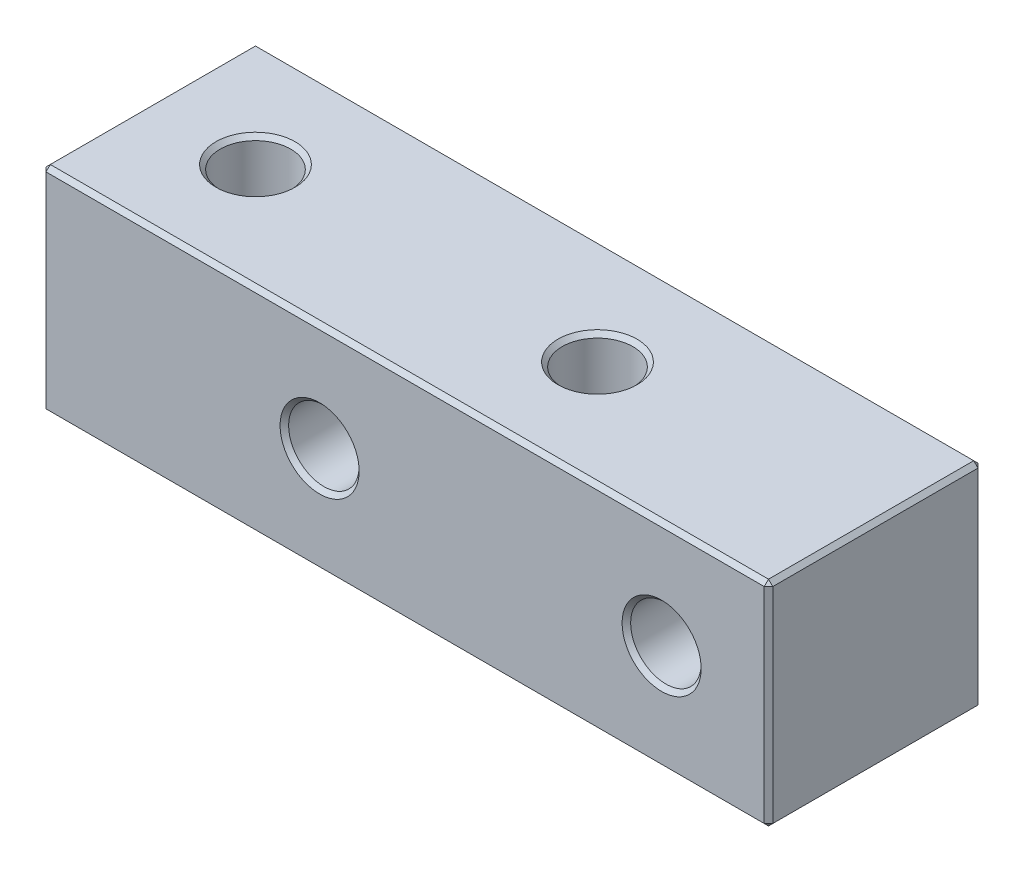
ISO-10303-21;
HEADER;
FILE_DESCRIPTION(('STEP AP214'),'2;1');
FILE_NAME('part.step','',(''),(''),'','','');
FILE_SCHEMA(('AUTOMOTIVE_DESIGN { 1 0 10303 214 1 1 1 1 }'));
ENDSEC;
DATA;
#1=APPLICATION_CONTEXT('core data for automotive mechanical design processes');
#2=APPLICATION_PROTOCOL_DEFINITION('international standard','automotive_design',2000,#1);
#3=PRODUCT_CONTEXT('',#1,'mechanical');
#4=PRODUCT('Part','Part','',(#3));
#5=PRODUCT_RELATED_PRODUCT_CATEGORY('part','',(#4));
#6=PRODUCT_DEFINITION_FORMATION('','',#4);
#7=PRODUCT_DEFINITION_CONTEXT('part definition',#1,'design');
#8=PRODUCT_DEFINITION('design','',#6,#7);
#9=PRODUCT_DEFINITION_SHAPE('','',#8);
#10=(LENGTH_UNIT() NAMED_UNIT(*) SI_UNIT(.MILLI.,.METRE.));
#11=(NAMED_UNIT(*) PLANE_ANGLE_UNIT() SI_UNIT($,.RADIAN.));
#12=(NAMED_UNIT(*) SI_UNIT($,.STERADIAN.) SOLID_ANGLE_UNIT());
#13=UNCERTAINTY_MEASURE_WITH_UNIT(LENGTH_MEASURE(1.E-05),#10,'distance_accuracy_value','');
#14=(GEOMETRIC_REPRESENTATION_CONTEXT(3) GLOBAL_UNCERTAINTY_ASSIGNED_CONTEXT((#13)) GLOBAL_UNIT_ASSIGNED_CONTEXT((#10,
#11,#12)) REPRESENTATION_CONTEXT('',''));
#15=CARTESIAN_POINT('',(0.,0.,0.));
#16=DIRECTION('',(0.,0.,1.));
#17=DIRECTION('',(1.,0.,0.));
#18=AXIS2_PLACEMENT_3D('',#15,#16,#17);
#19=CARTESIAN_POINT('',(17.,5.,-5.));
#20=DIRECTION('',(-1.,0.,0.));
#21=DIRECTION('',(0.,0.,1.));
#22=AXIS2_PLACEMENT_3D('',#19,#20,#21);
#23=PLANE('',#22);
#24=DIRECTION('',(0.,-1.,0.));
#25=VECTOR('',#24,1.);
#26=CARTESIAN_POINT('',(17.,5.,4.79999999999999));
#27=LINE('',#26,#25);
#28=CARTESIAN_POINT('',(17.,4.79999999999999,4.79999999999999));
#29=VERTEX_POINT('',#28);
#30=CARTESIAN_POINT('',(17.,-4.79999999999999,4.79999999999999));
#31=VERTEX_POINT('',#30);
#32=EDGE_CURVE('E239',#29,#31,#27,.T.);
#33=ORIENTED_EDGE('',*,*,#32,.T.);
#34=DIRECTION('',(0.,0.,-1.));
#35=VECTOR('',#34,1.);
#36=CARTESIAN_POINT('',(17.,-4.79999999999999,-5.));
#37=LINE('',#36,#35);
#38=CARTESIAN_POINT('',(17.,-4.79999999999999,-4.79999999999999));
#39=VERTEX_POINT('',#38);
#40=EDGE_CURVE('E241',#31,#39,#37,.T.);
#41=ORIENTED_EDGE('',*,*,#40,.T.);
#42=DIRECTION('',(0.,1.,0.));
#43=VECTOR('',#42,1.);
#44=CARTESIAN_POINT('',(17.,5.,-4.79999999999999));
#45=LINE('',#44,#43);
#46=CARTESIAN_POINT('',(17.,4.79999999999999,-4.79999999999999));
#47=VERTEX_POINT('',#46);
#48=EDGE_CURVE('E235',#39,#47,#45,.T.);
#49=ORIENTED_EDGE('',*,*,#48,.T.);
#50=DIRECTION('',(0.,0.,1.));
#51=VECTOR('',#50,1.);
#52=CARTESIAN_POINT('',(17.,4.79999999999999,5.));
#53=LINE('',#52,#51);
#54=EDGE_CURVE('E237',#47,#29,#53,.T.);
#55=ORIENTED_EDGE('',*,*,#54,.T.);
#56=EDGE_LOOP('',(#33,#41,#49,#55));
#57=FACE_BOUND('',#56,.T.);
#58=ADVANCED_FACE('F39',(#57),#23,.F.);
#59=CARTESIAN_POINT('',(-17.,5.,-5.));
#60=DIRECTION('',(0.,0.,1.));
#61=DIRECTION('',(1.,0.,0.));
#62=AXIS2_PLACEMENT_3D('',#59,#60,#61);
#63=PLANE('',#62);
#64=DIRECTION('',(1.,0.,0.));
#65=VECTOR('',#64,1.);
#66=CARTESIAN_POINT('',(17.,4.79999999999999,-5.));
#67=LINE('',#66,#65);
#68=CARTESIAN_POINT('',(-16.8,4.79999999999999,-5.));
#69=VERTEX_POINT('',#68);
#70=CARTESIAN_POINT('',(16.8,4.79999999999999,-5.));
#71=VERTEX_POINT('',#70);
#72=EDGE_CURVE('E49',#69,#71,#67,.T.);
#73=ORIENTED_EDGE('',*,*,#72,.T.);
#74=DIRECTION('',(0.,-1.,0.));
#75=VECTOR('',#74,1.);
#76=CARTESIAN_POINT('',(16.8,5.,-5.));
#77=LINE('',#76,#75);
#78=CARTESIAN_POINT('',(16.8,-4.79999999999999,-5.));
#79=VERTEX_POINT('',#78);
#80=EDGE_CURVE('E11',#71,#79,#77,.T.);
#81=ORIENTED_EDGE('',*,*,#80,.T.);
#82=DIRECTION('',(-1.,0.,0.));
#83=VECTOR('',#82,1.);
#84=CARTESIAN_POINT('',(-17.,-4.79999999999999,-5.));
#85=LINE('',#84,#83);
#86=CARTESIAN_POINT('',(-16.8,-4.79999999999999,-5.));
#87=VERTEX_POINT('',#86);
#88=EDGE_CURVE('E250',#79,#87,#85,.T.);
#89=ORIENTED_EDGE('',*,*,#88,.T.);
#90=DIRECTION('',(0.,1.,0.));
#91=VECTOR('',#90,1.);
#92=CARTESIAN_POINT('',(-16.8,5.,-5.));
#93=LINE('',#92,#91);
#94=EDGE_CURVE('E60',#87,#69,#93,.T.);
#95=ORIENTED_EDGE('',*,*,#94,.T.);
#96=EDGE_LOOP('',(#73,#81,#89,#95));
#97=FACE_BOUND('',#96,.T.);
#98=CARTESIAN_POINT('',(-4.,0.,-5.));
#99=DIRECTION('',(0.,0.,1.));
#100=DIRECTION('',(1.,0.,0.));
#101=AXIS2_PLACEMENT_3D('',#98,#99,#100);
#102=CIRCLE('',#101,1.85);
#103=CARTESIAN_POINT('',(-2.15,0.,-5.));
#104=VERTEX_POINT('',#103);
#105=EDGE_CURVE('E247',#104,#104,#102,.T.);
#106=ORIENTED_EDGE('',*,*,#105,.T.);
#107=EDGE_LOOP('',(#106));
#108=FACE_BOUND('',#107,.T.);
#109=CARTESIAN_POINT('',(12.,0.,-5.));
#110=DIRECTION('',(0.,0.,1.));
#111=DIRECTION('',(1.,0.,0.));
#112=AXIS2_PLACEMENT_3D('',#109,#110,#111);
#113=CIRCLE('',#112,1.85);
#114=CARTESIAN_POINT('',(13.85,0.,-5.));
#115=VERTEX_POINT('',#114);
#116=EDGE_CURVE('E244',#115,#115,#113,.T.);
#117=ORIENTED_EDGE('',*,*,#116,.T.);
#118=EDGE_LOOP('',(#117));
#119=FACE_BOUND('',#118,.T.);
#120=ADVANCED_FACE('F322',(#97,#108,#119),#63,.F.);
#121=CARTESIAN_POINT('',(-17.,5.,-5.));
#122=DIRECTION('',(1.,0.,0.));
#123=DIRECTION('',(0.,0.,-1.));
#124=AXIS2_PLACEMENT_3D('',#121,#122,#123);
#125=PLANE('',#124);
#126=DIRECTION('',(0.,-1.,0.));
#127=VECTOR('',#126,1.);
#128=CARTESIAN_POINT('',(-17.,5.,-4.79999999999999));
#129=LINE('',#128,#127);
#130=CARTESIAN_POINT('',(-17.,4.79999999999999,-4.79999999999999));
#131=VERTEX_POINT('',#130);
#132=CARTESIAN_POINT('',(-17.,-4.79999999999999,-4.79999999999999));
#133=VERTEX_POINT('',#132);
#134=EDGE_CURVE('E228',#131,#133,#129,.T.);
#135=ORIENTED_EDGE('',*,*,#134,.T.);
#136=DIRECTION('',(0.,0.,1.));
#137=VECTOR('',#136,1.);
#138=CARTESIAN_POINT('',(-17.,-4.79999999999999,-5.));
#139=LINE('',#138,#137);
#140=CARTESIAN_POINT('',(-17.,-4.79999999999999,4.79999999999999));
#141=VERTEX_POINT('',#140);
#142=EDGE_CURVE('E136',#133,#141,#139,.T.);
#143=ORIENTED_EDGE('',*,*,#142,.T.);
#144=DIRECTION('',(0.,1.,0.));
#145=VECTOR('',#144,1.);
#146=CARTESIAN_POINT('',(-17.,5.,4.79999999999999));
#147=LINE('',#146,#145);
#148=CARTESIAN_POINT('',(-17.,4.79999999999999,4.79999999999999));
#149=VERTEX_POINT('',#148);
#150=EDGE_CURVE('E232',#141,#149,#147,.T.);
#151=ORIENTED_EDGE('',*,*,#150,.T.);
#152=DIRECTION('',(0.,0.,-1.));
#153=VECTOR('',#152,1.);
#154=CARTESIAN_POINT('',(-17.,4.79999999999999,-5.));
#155=LINE('',#154,#153);
#156=EDGE_CURVE('E230',#149,#131,#155,.T.);
#157=ORIENTED_EDGE('',*,*,#156,.T.);
#158=EDGE_LOOP('',(#135,#143,#151,#157));
#159=FACE_BOUND('',#158,.T.);
#160=ADVANCED_FACE('F379',(#159),#125,.F.);
#161=CARTESIAN_POINT('',(-17.,5.,5.));
#162=DIRECTION('',(0.,0.,-1.));
#163=DIRECTION('',(-1.,0.,0.));
#164=AXIS2_PLACEMENT_3D('',#161,#162,#163);
#165=PLANE('',#164);
#166=CARTESIAN_POINT('',(-4.,0.,5.));
#167=DIRECTION('',(0.,0.,-1.));
#168=DIRECTION('',(-1.,0.,0.));
#169=AXIS2_PLACEMENT_3D('',#166,#167,#168);
#170=CIRCLE('',#169,1.85);
#171=CARTESIAN_POINT('',(-5.85,0.,5.));
#172=VERTEX_POINT('',#171);
#173=EDGE_CURVE('E198',#172,#172,#170,.T.);
#174=ORIENTED_EDGE('',*,*,#173,.T.);
#175=EDGE_LOOP('',(#174));
#176=FACE_BOUND('',#175,.T.);
#177=CARTESIAN_POINT('',(12.,0.,5.));
#178=DIRECTION('',(0.,0.,-1.));
#179=DIRECTION('',(-1.,0.,0.));
#180=AXIS2_PLACEMENT_3D('',#177,#178,#179);
#181=CIRCLE('',#180,1.85);
#182=CARTESIAN_POINT('',(10.15,0.,5.));
#183=VERTEX_POINT('',#182);
#184=EDGE_CURVE('E195',#183,#183,#181,.T.);
#185=ORIENTED_EDGE('',*,*,#184,.T.);
#186=EDGE_LOOP('',(#185));
#187=FACE_BOUND('',#186,.T.);
#188=DIRECTION('',(-1.,0.,0.));
#189=VECTOR('',#188,1.);
#190=CARTESIAN_POINT('',(-17.,4.79999999999999,5.));
#191=LINE('',#190,#189);
#192=CARTESIAN_POINT('',(16.8,4.79999999999999,5.));
#193=VERTEX_POINT('',#192);
#194=CARTESIAN_POINT('',(-16.8,4.79999999999999,5.));
#195=VERTEX_POINT('',#194);
#196=EDGE_CURVE('E186',#193,#195,#191,.T.);
#197=ORIENTED_EDGE('',*,*,#196,.T.);
#198=DIRECTION('',(0.,-1.,0.));
#199=VECTOR('',#198,1.);
#200=CARTESIAN_POINT('',(-16.8,5.,5.));
#201=LINE('',#200,#199);
#202=CARTESIAN_POINT('',(-16.8,-4.79999999999999,5.));
#203=VERTEX_POINT('',#202);
#204=EDGE_CURVE('E192',#195,#203,#201,.T.);
#205=ORIENTED_EDGE('',*,*,#204,.T.);
#206=DIRECTION('',(1.,0.,0.));
#207=VECTOR('',#206,1.);
#208=CARTESIAN_POINT('',(-17.,-4.79999999999999,5.));
#209=LINE('',#208,#207);
#210=CARTESIAN_POINT('',(16.8,-4.79999999999999,5.));
#211=VERTEX_POINT('',#210);
#212=EDGE_CURVE('E190',#203,#211,#209,.T.);
#213=ORIENTED_EDGE('',*,*,#212,.T.);
#214=DIRECTION('',(0.,1.,0.));
#215=VECTOR('',#214,1.);
#216=CARTESIAN_POINT('',(16.8,5.,5.));
#217=LINE('',#216,#215);
#218=EDGE_CURVE('E188',#211,#193,#217,.T.);
#219=ORIENTED_EDGE('',*,*,#218,.T.);
#220=EDGE_LOOP('',(#197,#205,#213,#219));
#221=FACE_BOUND('',#220,.T.);
#222=ADVANCED_FACE('F554',(#176,#187,#221),#165,.F.);
#223=CARTESIAN_POINT('',(0.,5.,0.));
#224=DIRECTION('',(0.,1.,0.));
#225=DIRECTION('',(0.,0.,1.));
#226=AXIS2_PLACEMENT_3D('',#223,#224,#225);
#227=PLANE('',#226);
#228=CARTESIAN_POINT('',(4.,5.,0.));
#229=DIRECTION('',(0.,1.,0.));
#230=DIRECTION('',(0.,0.,1.));
#231=AXIS2_PLACEMENT_3D('',#228,#229,#230);
#232=CIRCLE('',#231,1.84999999999999);
#233=CARTESIAN_POINT('',(4.,5.,1.84999999999999));
#234=VERTEX_POINT('',#233);
#235=EDGE_CURVE('E225',#234,#234,#232,.F.);
#236=ORIENTED_EDGE('',*,*,#235,.T.);
#237=EDGE_LOOP('',(#236));
#238=FACE_BOUND('',#237,.T.);
#239=CARTESIAN_POINT('',(-12.,5.,0.));
#240=DIRECTION('',(0.,1.,0.));
#241=DIRECTION('',(0.,0.,1.));
#242=AXIS2_PLACEMENT_3D('',#239,#240,#241);
#243=CIRCLE('',#242,1.84999999999999);
#244=CARTESIAN_POINT('',(-12.,5.,1.85));
#245=VERTEX_POINT('',#244);
#246=EDGE_CURVE('E222',#245,#245,#243,.F.);
#247=ORIENTED_EDGE('',*,*,#246,.T.);
#248=EDGE_LOOP('',(#247));
#249=FACE_BOUND('',#248,.T.);
#250=DIRECTION('',(0.,0.,1.));
#251=VECTOR('',#250,1.);
#252=CARTESIAN_POINT('',(-16.8,5.,5.));
#253=LINE('',#252,#251);
#254=CARTESIAN_POINT('',(-16.8,5.,-4.79999999999999));
#255=VERTEX_POINT('',#254);
#256=CARTESIAN_POINT('',(-16.8,5.,4.79999999999999));
#257=VERTEX_POINT('',#256);
#258=EDGE_CURVE('E217',#255,#257,#253,.T.);
#259=ORIENTED_EDGE('',*,*,#258,.T.);
#260=DIRECTION('',(1.,0.,0.));
#261=VECTOR('',#260,1.);
#262=CARTESIAN_POINT('',(17.,5.,4.79999999999999));
#263=LINE('',#262,#261);
#264=CARTESIAN_POINT('',(16.8,5.,4.79999999999999));
#265=VERTEX_POINT('',#264);
#266=EDGE_CURVE('E219',#257,#265,#263,.T.);
#267=ORIENTED_EDGE('',*,*,#266,.T.);
#268=DIRECTION('',(0.,0.,-1.));
#269=VECTOR('',#268,1.);
#270=CARTESIAN_POINT('',(16.8,5.,-5.));
#271=LINE('',#270,#269);
#272=CARTESIAN_POINT('',(16.8,5.,-4.79999999999999));
#273=VERTEX_POINT('',#272);
#274=EDGE_CURVE('E215',#265,#273,#271,.T.);
#275=ORIENTED_EDGE('',*,*,#274,.T.);
#276=DIRECTION('',(-1.,0.,0.));
#277=VECTOR('',#276,1.);
#278=CARTESIAN_POINT('',(-17.,5.,-4.79999999999999));
#279=LINE('',#278,#277);
#280=EDGE_CURVE('E213',#273,#255,#279,.T.);
#281=ORIENTED_EDGE('',*,*,#280,.T.);
#282=EDGE_LOOP('',(#259,#267,#275,#281));
#283=FACE_BOUND('',#282,.T.);
#284=ADVANCED_FACE('F336',(#238,#249,#283),#227,.T.);
#285=CARTESIAN_POINT('',(0.,-5.,0.));
#286=DIRECTION('',(0.,1.,0.));
#287=DIRECTION('',(0.,0.,1.));
#288=AXIS2_PLACEMENT_3D('',#285,#286,#287);
#289=PLANE('',#288);
#290=CARTESIAN_POINT('',(4.,-5.,0.));
#291=DIRECTION('',(0.,1.,0.));
#292=DIRECTION('',(0.,0.,1.));
#293=AXIS2_PLACEMENT_3D('',#290,#291,#292);
#294=CIRCLE('',#293,1.85);
#295=CARTESIAN_POINT('',(4.,-5.,1.85));
#296=VERTEX_POINT('',#295);
#297=EDGE_CURVE('E171',#296,#296,#294,.T.);
#298=ORIENTED_EDGE('',*,*,#297,.T.);
#299=EDGE_LOOP('',(#298));
#300=FACE_BOUND('',#299,.T.);
#301=CARTESIAN_POINT('',(-12.,-5.,0.));
#302=DIRECTION('',(0.,1.,0.));
#303=DIRECTION('',(0.,0.,1.));
#304=AXIS2_PLACEMENT_3D('',#301,#302,#303);
#305=CIRCLE('',#304,1.85);
#306=CARTESIAN_POINT('',(-12.,-5.,1.85));
#307=VERTEX_POINT('',#306);
#308=EDGE_CURVE('E165',#307,#307,#305,.T.);
#309=ORIENTED_EDGE('',*,*,#308,.T.);
#310=EDGE_LOOP('',(#309));
#311=FACE_BOUND('',#310,.T.);
#312=DIRECTION('',(0.,0.,1.));
#313=VECTOR('',#312,1.);
#314=CARTESIAN_POINT('',(16.8,-5.,0.));
#315=LINE('',#314,#313);
#316=CARTESIAN_POINT('',(16.8,-5.,-4.79999999999999));
#317=VERTEX_POINT('',#316);
#318=CARTESIAN_POINT('',(16.8,-5.,4.79999999999999));
#319=VERTEX_POINT('',#318);
#320=EDGE_CURVE('E158',#317,#319,#315,.T.);
#321=ORIENTED_EDGE('',*,*,#320,.T.);
#322=DIRECTION('',(-1.,0.,0.));
#323=VECTOR('',#322,1.);
#324=CARTESIAN_POINT('',(0.,-5.,4.79999999999999));
#325=LINE('',#324,#323);
#326=CARTESIAN_POINT('',(-16.8,-5.,4.79999999999999));
#327=VERTEX_POINT('',#326);
#328=EDGE_CURVE('E162',#319,#327,#325,.T.);
#329=ORIENTED_EDGE('',*,*,#328,.T.);
#330=DIRECTION('',(0.,0.,-1.));
#331=VECTOR('',#330,1.);
#332=CARTESIAN_POINT('',(-16.8,-5.,0.));
#333=LINE('',#332,#331);
#334=CARTESIAN_POINT('',(-16.8,-5.,-4.79999999999999));
#335=VERTEX_POINT('',#334);
#336=EDGE_CURVE('E133',#327,#335,#333,.T.);
#337=ORIENTED_EDGE('',*,*,#336,.T.);
#338=DIRECTION('',(1.,0.,0.));
#339=VECTOR('',#338,1.);
#340=CARTESIAN_POINT('',(0.,-5.,-4.79999999999999));
#341=LINE('',#340,#339);
#342=EDGE_CURVE('E152',#335,#317,#341,.T.);
#343=ORIENTED_EDGE('',*,*,#342,.T.);
#344=EDGE_LOOP('',(#321,#329,#337,#343));
#345=FACE_BOUND('',#344,.T.);
#346=ADVANCED_FACE('F160',(#300,#311,#345),#289,.F.);
#347=CARTESIAN_POINT('',(4.,5.,0.));
#348=DIRECTION('',(0.,1.,0.));
#349=DIRECTION('',(0.,0.,1.));
#350=AXIS2_PLACEMENT_3D('',#347,#348,#349);
#351=CYLINDRICAL_SURFACE('',#350,1.65);
#352=CARTESIAN_POINT('',(4.,-4.79999999999999,0.));
#353=DIRECTION('',(0.,1.,0.));
#354=DIRECTION('',(0.,0.,1.));
#355=AXIS2_PLACEMENT_3D('',#352,#353,#354);
#356=CIRCLE('',#355,1.65);
#357=CARTESIAN_POINT('',(4.,-4.79999999999999,1.65));
#358=VERTEX_POINT('',#357);
#359=EDGE_CURVE('E177',#358,#358,#356,.F.);
#360=ORIENTED_EDGE('',*,*,#359,.T.);
#361=EDGE_LOOP('',(#360));
#362=FACE_BOUND('',#361,.T.);
#363=CARTESIAN_POINT('',(4.,4.80000000000001,0.));
#364=DIRECTION('',(0.,1.,0.));
#365=DIRECTION('',(0.,0.,1.));
#366=AXIS2_PLACEMENT_3D('',#363,#364,#365);
#367=CIRCLE('',#366,1.65);
#368=CARTESIAN_POINT('',(4.,4.80000000000001,1.65));
#369=VERTEX_POINT('',#368);
#370=EDGE_CURVE('E174',#369,#369,#367,.T.);
#371=ORIENTED_EDGE('',*,*,#370,.T.);
#372=EDGE_LOOP('',(#371));
#373=FACE_BOUND('',#372,.T.);
#374=ADVANCED_FACE('F545',(#362,#373),#351,.F.);
#375=CARTESIAN_POINT('',(-12.,5.,0.));
#376=DIRECTION('',(0.,1.,0.));
#377=DIRECTION('',(0.,0.,1.));
#378=AXIS2_PLACEMENT_3D('',#375,#376,#377);
#379=CYLINDRICAL_SURFACE('',#378,1.65);
#380=CARTESIAN_POINT('',(-12.,-4.8,0.));
#381=DIRECTION('',(0.,1.,0.));
#382=DIRECTION('',(0.,0.,1.));
#383=AXIS2_PLACEMENT_3D('',#380,#381,#382);
#384=CIRCLE('',#383,1.65);
#385=CARTESIAN_POINT('',(-12.,-4.8,1.65));
#386=VERTEX_POINT('',#385);
#387=EDGE_CURVE('E183',#386,#386,#384,.F.);
#388=ORIENTED_EDGE('',*,*,#387,.T.);
#389=EDGE_LOOP('',(#388));
#390=FACE_BOUND('',#389,.T.);
#391=CARTESIAN_POINT('',(-12.,4.80000000000001,0.));
#392=DIRECTION('',(0.,1.,0.));
#393=DIRECTION('',(0.,0.,1.));
#394=AXIS2_PLACEMENT_3D('',#391,#392,#393);
#395=CIRCLE('',#394,1.65);
#396=CARTESIAN_POINT('',(-12.,4.80000000000001,1.65));
#397=VERTEX_POINT('',#396);
#398=EDGE_CURVE('E180',#397,#397,#395,.T.);
#399=ORIENTED_EDGE('',*,*,#398,.T.);
#400=EDGE_LOOP('',(#399));
#401=FACE_BOUND('',#400,.T.);
#402=ADVANCED_FACE('F536',(#390,#401),#379,.F.);
#403=CARTESIAN_POINT('',(-4.,0.,-5.));
#404=DIRECTION('',(0.,0.,-1.));
#405=DIRECTION('',(-1.,0.,0.));
#406=AXIS2_PLACEMENT_3D('',#403,#404,#405);
#407=CYLINDRICAL_SURFACE('',#406,1.65);
#408=CARTESIAN_POINT('',(-4.,0.,4.8));
#409=DIRECTION('',(0.,0.,-1.));
#410=DIRECTION('',(-1.,0.,0.));
#411=AXIS2_PLACEMENT_3D('',#408,#409,#410);
#412=CIRCLE('',#411,1.65);
#413=CARTESIAN_POINT('',(-5.65,0.,4.8));
#414=VERTEX_POINT('',#413);
#415=EDGE_CURVE('E204',#414,#414,#412,.F.);
#416=ORIENTED_EDGE('',*,*,#415,.T.);
#417=EDGE_LOOP('',(#416));
#418=FACE_BOUND('',#417,.T.);
#419=CARTESIAN_POINT('',(-4.,0.,-4.8));
#420=DIRECTION('',(0.,0.,1.));
#421=DIRECTION('',(1.,0.,0.));
#422=AXIS2_PLACEMENT_3D('',#419,#420,#421);
#423=CIRCLE('',#422,1.65);
#424=CARTESIAN_POINT('',(-2.35,0.,-4.8));
#425=VERTEX_POINT('',#424);
#426=EDGE_CURVE('E201',#425,#425,#423,.F.);
#427=ORIENTED_EDGE('',*,*,#426,.T.);
#428=EDGE_LOOP('',(#427));
#429=FACE_BOUND('',#428,.T.);
#430=ADVANCED_FACE('F534',(#418,#429),#407,.F.);
#431=CARTESIAN_POINT('',(12.,0.,-5.));
#432=DIRECTION('',(0.,0.,-1.));
#433=DIRECTION('',(-1.,0.,0.));
#434=AXIS2_PLACEMENT_3D('',#431,#432,#433);
#435=CYLINDRICAL_SURFACE('',#434,1.65);
#436=CARTESIAN_POINT('',(12.,0.,4.8));
#437=DIRECTION('',(0.,0.,-1.));
#438=DIRECTION('',(-1.,0.,0.));
#439=AXIS2_PLACEMENT_3D('',#436,#437,#438);
#440=CIRCLE('',#439,1.65);
#441=CARTESIAN_POINT('',(10.35,0.,4.8));
#442=VERTEX_POINT('',#441);
#443=EDGE_CURVE('E210',#442,#442,#440,.F.);
#444=ORIENTED_EDGE('',*,*,#443,.T.);
#445=EDGE_LOOP('',(#444));
#446=FACE_BOUND('',#445,.T.);
#447=CARTESIAN_POINT('',(12.,0.,-4.8));
#448=DIRECTION('',(0.,0.,1.));
#449=DIRECTION('',(1.,0.,0.));
#450=AXIS2_PLACEMENT_3D('',#447,#448,#449);
#451=CIRCLE('',#450,1.65);
#452=CARTESIAN_POINT('',(13.65,0.,-4.8));
#453=VERTEX_POINT('',#452);
#454=EDGE_CURVE('E207',#453,#453,#451,.F.);
#455=ORIENTED_EDGE('',*,*,#454,.T.);
#456=EDGE_LOOP('',(#455));
#457=FACE_BOUND('',#456,.T.);
#458=ADVANCED_FACE('F391',(#446,#457),#435,.F.);
#459=CARTESIAN_POINT('',(4.,-5.,0.));
#460=DIRECTION('',(0.,-1.,0.));
#461=DIRECTION('',(0.,0.,-1.));
#462=AXIS2_PLACEMENT_3D('',#459,#460,#461);
#463=CONICAL_SURFACE('',#462,1.85,0.785398163397445);
#464=ORIENTED_EDGE('',*,*,#359,.F.);
#465=EDGE_LOOP('',(#464));
#466=FACE_BOUND('',#465,.T.);
#467=ORIENTED_EDGE('',*,*,#297,.F.);
#468=EDGE_LOOP('',(#467));
#469=FACE_BOUND('',#468,.T.);
#470=ADVANCED_FACE('F384',(#466,#469),#463,.F.);
#471=CARTESIAN_POINT('',(-12.,-5.,0.));
#472=DIRECTION('',(0.,-1.,0.));
#473=DIRECTION('',(0.,0.,-1.));
#474=AXIS2_PLACEMENT_3D('',#471,#472,#473);
#475=CONICAL_SURFACE('',#474,1.85,0.785398163397455);
#476=ORIENTED_EDGE('',*,*,#387,.F.);
#477=EDGE_LOOP('',(#476));
#478=FACE_BOUND('',#477,.T.);
#479=ORIENTED_EDGE('',*,*,#308,.F.);
#480=EDGE_LOOP('',(#479));
#481=FACE_BOUND('',#480,.T.);
#482=ADVANCED_FACE('F390',(#478,#481),#475,.F.);
#483=CARTESIAN_POINT('',(-4.,0.,5.));
#484=DIRECTION('',(0.,0.,1.));
#485=DIRECTION('',(1.,0.,0.));
#486=AXIS2_PLACEMENT_3D('',#483,#484,#485);
#487=CONICAL_SURFACE('',#486,1.85,0.785398163397453);
#488=ORIENTED_EDGE('',*,*,#415,.F.);
#489=EDGE_LOOP('',(#488));
#490=FACE_BOUND('',#489,.T.);
#491=ORIENTED_EDGE('',*,*,#173,.F.);
#492=EDGE_LOOP('',(#491));
#493=FACE_BOUND('',#492,.T.);
#494=ADVANCED_FACE('F398',(#490,#493),#487,.F.);
#495=CARTESIAN_POINT('',(12.,0.,5.));
#496=DIRECTION('',(0.,0.,1.));
#497=DIRECTION('',(1.,0.,0.));
#498=AXIS2_PLACEMENT_3D('',#495,#496,#497);
#499=CONICAL_SURFACE('',#498,1.85,0.785398163397444);
#500=ORIENTED_EDGE('',*,*,#443,.F.);
#501=EDGE_LOOP('',(#500));
#502=FACE_BOUND('',#501,.T.);
#503=ORIENTED_EDGE('',*,*,#184,.F.);
#504=EDGE_LOOP('',(#503));
#505=FACE_BOUND('',#504,.T.);
#506=ADVANCED_FACE('F405',(#502,#505),#499,.F.);
#507=CARTESIAN_POINT('',(4.,4.80000000000001,0.));
#508=DIRECTION('',(0.,1.,0.));
#509=DIRECTION('',(0.,0.,1.));
#510=AXIS2_PLACEMENT_3D('',#507,#508,#509);
#511=CONICAL_SURFACE('',#510,1.65,0.785398163397451);
#512=CARTESIAN_POINT('',(4.,5.,1.84999999999999));
#513=CARTESIAN_POINT('',(4.,4.99791666666667,1.84791666666666));
#514=CARTESIAN_POINT('',(4.,4.99583333333333,1.84583333333333));
#515=CARTESIAN_POINT('',(4.,4.99166666666667,1.84166666666666));
#516=CARTESIAN_POINT('',(4.,4.98958333333333,1.83958333333333));
#517=CARTESIAN_POINT('',(4.,4.98541666666667,1.83541666666666));
#518=CARTESIAN_POINT('',(4.,4.98333333333333,1.83333333333333));
#519=CARTESIAN_POINT('',(4.,4.97916666666667,1.82916666666666));
#520=CARTESIAN_POINT('',(4.,4.97708333333333,1.82708333333333));
#521=CARTESIAN_POINT('',(4.,4.97291666666667,1.82291666666666));
#522=CARTESIAN_POINT('',(4.,4.97083333333333,1.82083333333333));
#523=CARTESIAN_POINT('',(4.,4.96666666666667,1.81666666666666));
#524=CARTESIAN_POINT('',(4.,4.96458333333333,1.81458333333333));
#525=CARTESIAN_POINT('',(4.,4.96041666666667,1.81041666666666));
#526=CARTESIAN_POINT('',(4.,4.95833333333333,1.80833333333333));
#527=CARTESIAN_POINT('',(4.,4.95416666666667,1.80416666666666));
#528=CARTESIAN_POINT('',(4.,4.95208333333333,1.80208333333333));
#529=CARTESIAN_POINT('',(4.,4.94791666666667,1.79791666666666));
#530=CARTESIAN_POINT('',(4.,4.94583333333333,1.79583333333333));
#531=CARTESIAN_POINT('',(4.,4.94166666666667,1.79166666666666));
#532=CARTESIAN_POINT('',(4.,4.93958333333333,1.78958333333333));
#533=CARTESIAN_POINT('',(4.,4.93541666666667,1.78541666666666));
#534=CARTESIAN_POINT('',(4.,4.93333333333333,1.78333333333333));
#535=CARTESIAN_POINT('',(4.,4.92916666666667,1.77916666666666));
#536=CARTESIAN_POINT('',(4.,4.92708333333333,1.77708333333333));
#537=CARTESIAN_POINT('',(4.,4.92291666666667,1.77291666666666));
#538=CARTESIAN_POINT('',(4.,4.92083333333334,1.77083333333333));
#539=CARTESIAN_POINT('',(4.,4.91666666666667,1.76666666666666));
#540=CARTESIAN_POINT('',(4.,4.91458333333333,1.76458333333333));
#541=CARTESIAN_POINT('',(4.,4.91041666666667,1.76041666666666));
#542=CARTESIAN_POINT('',(4.,4.90833333333334,1.75833333333333));
#543=CARTESIAN_POINT('',(4.,4.90416666666667,1.75416666666666));
#544=CARTESIAN_POINT('',(4.,4.90208333333334,1.75208333333333));
#545=CARTESIAN_POINT('',(4.,4.89791666666667,1.74791666666666));
#546=CARTESIAN_POINT('',(4.,4.89583333333334,1.74583333333333));
#547=CARTESIAN_POINT('',(4.,4.89166666666667,1.74166666666666));
#548=CARTESIAN_POINT('',(4.,4.88958333333334,1.73958333333333));
#549=CARTESIAN_POINT('',(4.,4.88541666666667,1.73541666666666));
#550=CARTESIAN_POINT('',(4.,4.88333333333334,1.73333333333333));
#551=CARTESIAN_POINT('',(4.,4.87916666666667,1.72916666666666));
#552=CARTESIAN_POINT('',(4.,4.87708333333334,1.72708333333333));
#553=CARTESIAN_POINT('',(4.,4.87291666666667,1.72291666666666));
#554=CARTESIAN_POINT('',(4.,4.87083333333334,1.72083333333333));
#555=CARTESIAN_POINT('',(4.,4.86666666666667,1.71666666666666));
#556=CARTESIAN_POINT('',(4.,4.86458333333334,1.71458333333333));
#557=CARTESIAN_POINT('',(4.,4.86041666666667,1.71041666666666));
#558=CARTESIAN_POINT('',(4.,4.85833333333334,1.70833333333333));
#559=CARTESIAN_POINT('',(4.,4.85416666666667,1.70416666666666));
#560=CARTESIAN_POINT('',(4.,4.85208333333334,1.70208333333333));
#561=CARTESIAN_POINT('',(4.,4.84791666666667,1.69791666666666));
#562=CARTESIAN_POINT('',(4.,4.84583333333334,1.69583333333333));
#563=CARTESIAN_POINT('',(4.,4.84166666666667,1.69166666666666));
#564=CARTESIAN_POINT('',(4.,4.83958333333334,1.68958333333333));
#565=CARTESIAN_POINT('',(4.,4.83541666666667,1.68541666666666));
#566=CARTESIAN_POINT('',(4.,4.83333333333334,1.68333333333333));
#567=CARTESIAN_POINT('',(4.,4.82916666666667,1.67916666666666));
#568=CARTESIAN_POINT('',(4.,4.82708333333334,1.67708333333333));
#569=CARTESIAN_POINT('',(4.,4.82291666666667,1.67291666666666));
#570=CARTESIAN_POINT('',(4.,4.82083333333334,1.67083333333333));
#571=CARTESIAN_POINT('',(4.,4.81666666666667,1.66666666666666));
#572=CARTESIAN_POINT('',(4.,4.81458333333334,1.66458333333333));
#573=CARTESIAN_POINT('',(4.,4.81041666666667,1.66041666666666));
#574=CARTESIAN_POINT('',(4.,4.80833333333334,1.65833333333333));
#575=CARTESIAN_POINT('',(4.,4.80416666666667,1.65416666666666));
#576=CARTESIAN_POINT('',(4.,4.80208333333334,1.65208333333333));
#577=CARTESIAN_POINT('',(4.,4.80000000000001,1.65));
#578=B_SPLINE_CURVE_WITH_KNOTS('',3,(#512,#513,#514,#515,#516,#517,#518,#519,#520,#521,#522,
#523,#524,#525,#526,#527,#528,#529,#530,#531,#532,#533,#534,#535,#536,#537,#538,#539,#540,#541,
#542,#543,#544,#545,#546,#547,#548,#549,#550,#551,#552,#553,#554,#555,#556,#557,#558,#559,#560,
#561,#562,#563,#564,#565,#566,#567,#568,#569,#570,#571,#572,#573,#574,#575,#576,#577),
.UNSPECIFIED.,.F.,.F.,(4,2,2,2,2,2,2,2,2,2,2,2,2,2,2,2,2,2,2,2,2,2,2,2,2,2,2,2,2,2,2,2,4),(0.,
0.00883883476483179,0.0176776695296637,0.0265165042944951,0.0353553390593269,0.0441941738241582,
0.05303300858899,0.0618718433538219,0.0707106781186531,0.079549512883485,0.0883883476483162,
0.0972271824131481,0.10606601717798,0.114904851942811,0.123743686707643,0.132582521472474,
0.141421356237306,0.150260191002138,0.159099025766969,0.167937860531801,0.176776695296633,
0.185615530061465,0.194454364826296,0.203293199591128,0.21213203435596,0.220970869120791,
0.229809703885623,0.238648538650455,0.247487373415286,0.256326208180118,0.265165042944949,
0.274003877709781,0.282842712474612),.UNSPECIFIED.);
#579=EDGE_CURVE('BSEAM412',#234,#369,#578,.T.);
#580=ORIENTED_EDGE('',*,*,#235,.F.);
#581=ORIENTED_EDGE('',*,*,#370,.F.);
#582=ORIENTED_EDGE('',*,*,#579,.T.);
#583=ORIENTED_EDGE('',*,*,#579,.F.);
#584=EDGE_LOOP('',(#580,#582,#581,#583));
#585=FACE_BOUND('',#584,.T.);
#586=ADVANCED_FACE('F412',(#585),#511,.F.);
#587=CARTESIAN_POINT('',(-12.,4.80000000000001,0.));
#588=DIRECTION('',(0.,1.,0.));
#589=DIRECTION('',(0.,0.,1.));
#590=AXIS2_PLACEMENT_3D('',#587,#588,#589);
#591=CONICAL_SURFACE('',#590,1.65,0.785398163397453);
#592=CARTESIAN_POINT('',(-12.,5.,1.85));
#593=CARTESIAN_POINT('',(-12.,4.99791666666667,1.84791666666666));
#594=CARTESIAN_POINT('',(-12.,4.99583333333333,1.84583333333333));
#595=CARTESIAN_POINT('',(-12.,4.99166666666667,1.84166666666666));
#596=CARTESIAN_POINT('',(-12.,4.98958333333333,1.83958333333333));
#597=CARTESIAN_POINT('',(-12.,4.98541666666667,1.83541666666666));
#598=CARTESIAN_POINT('',(-12.,4.98333333333333,1.83333333333333));
#599=CARTESIAN_POINT('',(-12.,4.97916666666667,1.82916666666666));
#600=CARTESIAN_POINT('',(-12.,4.97708333333333,1.82708333333333));
#601=CARTESIAN_POINT('',(-12.,4.97291666666667,1.82291666666666));
#602=CARTESIAN_POINT('',(-12.,4.97083333333333,1.82083333333333));
#603=CARTESIAN_POINT('',(-12.,4.96666666666667,1.81666666666666));
#604=CARTESIAN_POINT('',(-12.,4.96458333333333,1.81458333333333));
#605=CARTESIAN_POINT('',(-12.,4.96041666666667,1.81041666666666));
#606=CARTESIAN_POINT('',(-12.,4.95833333333333,1.80833333333333));
#607=CARTESIAN_POINT('',(-12.,4.95416666666667,1.80416666666666));
#608=CARTESIAN_POINT('',(-12.,4.95208333333333,1.80208333333333));
#609=CARTESIAN_POINT('',(-12.,4.94791666666667,1.79791666666666));
#610=CARTESIAN_POINT('',(-12.,4.94583333333333,1.79583333333333));
#611=CARTESIAN_POINT('',(-12.,4.94166666666667,1.79166666666666));
#612=CARTESIAN_POINT('',(-12.,4.93958333333333,1.78958333333333));
#613=CARTESIAN_POINT('',(-12.,4.93541666666667,1.78541666666666));
#614=CARTESIAN_POINT('',(-12.,4.93333333333333,1.78333333333333));
#615=CARTESIAN_POINT('',(-12.,4.92916666666667,1.77916666666666));
#616=CARTESIAN_POINT('',(-12.,4.92708333333333,1.77708333333333));
#617=CARTESIAN_POINT('',(-12.,4.92291666666667,1.77291666666666));
#618=CARTESIAN_POINT('',(-12.,4.92083333333334,1.77083333333333));
#619=CARTESIAN_POINT('',(-12.,4.91666666666667,1.76666666666666));
#620=CARTESIAN_POINT('',(-12.,4.91458333333333,1.76458333333333));
#621=CARTESIAN_POINT('',(-12.,4.91041666666667,1.76041666666666));
#622=CARTESIAN_POINT('',(-12.,4.90833333333334,1.75833333333333));
#623=CARTESIAN_POINT('',(-12.,4.90416666666667,1.75416666666666));
#624=CARTESIAN_POINT('',(-12.,4.90208333333334,1.75208333333333));
#625=CARTESIAN_POINT('',(-12.,4.89791666666667,1.74791666666666));
#626=CARTESIAN_POINT('',(-12.,4.89583333333334,1.74583333333333));
#627=CARTESIAN_POINT('',(-12.,4.89166666666667,1.74166666666666));
#628=CARTESIAN_POINT('',(-12.,4.88958333333334,1.73958333333333));
#629=CARTESIAN_POINT('',(-12.,4.88541666666667,1.73541666666666));
#630=CARTESIAN_POINT('',(-12.,4.88333333333334,1.73333333333333));
#631=CARTESIAN_POINT('',(-12.,4.87916666666667,1.72916666666666));
#632=CARTESIAN_POINT('',(-12.,4.87708333333334,1.72708333333333));
#633=CARTESIAN_POINT('',(-12.,4.87291666666667,1.72291666666666));
#634=CARTESIAN_POINT('',(-12.,4.87083333333334,1.72083333333333));
#635=CARTESIAN_POINT('',(-12.,4.86666666666667,1.71666666666666));
#636=CARTESIAN_POINT('',(-12.,4.86458333333334,1.71458333333333));
#637=CARTESIAN_POINT('',(-12.,4.86041666666667,1.71041666666666));
#638=CARTESIAN_POINT('',(-12.,4.85833333333334,1.70833333333333));
#639=CARTESIAN_POINT('',(-12.,4.85416666666667,1.70416666666666));
#640=CARTESIAN_POINT('',(-12.,4.85208333333334,1.70208333333333));
#641=CARTESIAN_POINT('',(-12.,4.84791666666667,1.69791666666666));
#642=CARTESIAN_POINT('',(-12.,4.84583333333334,1.69583333333333));
#643=CARTESIAN_POINT('',(-12.,4.84166666666667,1.69166666666666));
#644=CARTESIAN_POINT('',(-12.,4.83958333333334,1.68958333333333));
#645=CARTESIAN_POINT('',(-12.,4.83541666666667,1.68541666666667));
#646=CARTESIAN_POINT('',(-12.,4.83333333333334,1.68333333333333));
#647=CARTESIAN_POINT('',(-12.,4.82916666666667,1.67916666666666));
#648=CARTESIAN_POINT('',(-12.,4.82708333333334,1.67708333333333));
#649=CARTESIAN_POINT('',(-12.,4.82291666666667,1.67291666666667));
#650=CARTESIAN_POINT('',(-12.,4.82083333333334,1.67083333333333));
#651=CARTESIAN_POINT('',(-12.,4.81666666666667,1.66666666666667));
#652=CARTESIAN_POINT('',(-12.,4.81458333333334,1.66458333333333));
#653=CARTESIAN_POINT('',(-12.,4.81041666666667,1.66041666666667));
#654=CARTESIAN_POINT('',(-12.,4.80833333333334,1.65833333333333));
#655=CARTESIAN_POINT('',(-12.,4.80416666666667,1.65416666666667));
#656=CARTESIAN_POINT('',(-12.,4.80208333333334,1.65208333333333));
#657=CARTESIAN_POINT('',(-12.,4.80000000000001,1.65));
#658=B_SPLINE_CURVE_WITH_KNOTS('',3,(#592,#593,#594,#595,#596,#597,#598,#599,#600,#601,#602,
#603,#604,#605,#606,#607,#608,#609,#610,#611,#612,#613,#614,#615,#616,#617,#618,#619,#620,#621,
#622,#623,#624,#625,#626,#627,#628,#629,#630,#631,#632,#633,#634,#635,#636,#637,#638,#639,#640,
#641,#642,#643,#644,#645,#646,#647,#648,#649,#650,#651,#652,#653,#654,#655,#656,#657),
.UNSPECIFIED.,.F.,.F.,(4,2,2,2,2,2,2,2,2,2,2,2,2,2,2,2,2,2,2,2,2,2,2,2,2,2,2,2,2,2,2,2,4),(0.,
0.00883883476483179,0.0176776695296637,0.0265165042944951,0.0353553390593269,0.0441941738241582,
0.0530330085889901,0.0618718433538219,0.0707106781186533,0.0795495128834852,0.0883883476483164,
0.0972271824131483,0.10606601717798,0.114904851942811,0.123743686707643,0.132582521472475,
0.141421356237306,0.150260191002138,0.15909902576697,0.167937860531802,0.176776695296633,
0.185615530061465,0.194454364826297,0.203293199591128,0.21213203435596,0.220970869120791,
0.229809703885623,0.238648538650455,0.247487373415286,0.256326208180118,0.265165042944949,
0.274003877709781,0.282842712474612),.UNSPECIFIED.);
#659=EDGE_CURVE('BSEAM419',#245,#397,#658,.T.);
#660=ORIENTED_EDGE('',*,*,#246,.F.);
#661=ORIENTED_EDGE('',*,*,#398,.F.);
#662=ORIENTED_EDGE('',*,*,#659,.T.);
#663=ORIENTED_EDGE('',*,*,#659,.F.);
#664=EDGE_LOOP('',(#660,#662,#661,#663));
#665=FACE_BOUND('',#664,.T.);
#666=ADVANCED_FACE('F419',(#665),#591,.F.);
#667=CARTESIAN_POINT('',(16.8,5.,0.));
#668=DIRECTION('',(0.707106781186548,0.707106781186548,0.));
#669=DIRECTION('',(0.,0.,1.));
#670=AXIS2_PLACEMENT_3D('',#667,#668,#669);
#671=PLANE('',#670);
#672=DIRECTION('',(0.707106781186548,-0.707106781186548,0.));
#673=VECTOR('',#672,1.);
#674=CARTESIAN_POINT('',(16.8,5.,-4.79999999999999));
#675=LINE('',#674,#673);
#676=EDGE_CURVE('E44',#273,#47,#675,.T.);
#677=ORIENTED_EDGE('',*,*,#676,.F.);
#678=ORIENTED_EDGE('',*,*,#274,.F.);
#679=DIRECTION('',(-0.707106781186548,0.707106781186548,0.));
#680=VECTOR('',#679,1.);
#681=CARTESIAN_POINT('',(16.9,4.9,4.79999999999999));
#682=LINE('',#681,#680);
#683=EDGE_CURVE('E301',#29,#265,#682,.T.);
#684=ORIENTED_EDGE('',*,*,#683,.F.);
#685=ORIENTED_EDGE('',*,*,#54,.F.);
#686=EDGE_LOOP('',(#677,#678,#684,#685));
#687=FACE_BOUND('',#686,.T.);
#688=ADVANCED_FACE('F426',(#687),#671,.T.);
#689=CARTESIAN_POINT('',(16.8,5.,-4.79999999999999));
#690=DIRECTION('',(0.577350269189626,0.577350269189626,-0.577350269189626));
#691=DIRECTION('',(-0.707106781186547,0.,-0.707106781186547));
#692=AXIS2_PLACEMENT_3D('',#689,#690,#691);
#693=PLANE('',#692);
#694=DIRECTION('',(0.,0.707106781186548,0.707106781186548));
#695=VECTOR('',#694,1.);
#696=CARTESIAN_POINT('',(16.8,5.,-4.79999999999999));
#697=LINE('',#696,#695);
#698=EDGE_CURVE('E297',#273,#71,#697,.F.);
#699=ORIENTED_EDGE('',*,*,#698,.F.);
#700=ORIENTED_EDGE('',*,*,#676,.T.);
#701=DIRECTION('',(0.707106781186548,0.,0.707106781186548));
#702=VECTOR('',#701,1.);
#703=CARTESIAN_POINT('',(16.9,4.79999999999999,-4.9));
#704=LINE('',#703,#702);
#705=EDGE_CURVE('E299',#71,#47,#704,.T.);
#706=ORIENTED_EDGE('',*,*,#705,.F.);
#707=EDGE_LOOP('',(#699,#700,#706));
#708=FACE_BOUND('',#707,.T.);
#709=ADVANCED_FACE('F313',(#708),#693,.T.);
#710=CARTESIAN_POINT('',(16.8,4.79999999999999,5.));
#711=DIRECTION('',(0.577350269189626,0.577350269189626,0.577350269189626));
#712=DIRECTION('',(0.707106781186547,0.,-0.707106781186547));
#713=AXIS2_PLACEMENT_3D('',#710,#711,#712);
#714=PLANE('',#713);
#715=DIRECTION('',(-0.707106781186548,0.,0.707106781186548));
#716=VECTOR('',#715,1.);
#717=CARTESIAN_POINT('',(16.8,4.79999999999999,5.));
#718=LINE('',#717,#716);
#719=EDGE_CURVE('E292',#29,#193,#718,.T.);
#720=ORIENTED_EDGE('',*,*,#719,.F.);
#721=ORIENTED_EDGE('',*,*,#683,.T.);
#722=DIRECTION('',(0.,-0.707106781186548,0.707106781186548));
#723=VECTOR('',#722,1.);
#724=CARTESIAN_POINT('',(16.8,4.79999999999999,5.));
#725=LINE('',#724,#723);
#726=EDGE_CURVE('E295',#193,#265,#725,.F.);
#727=ORIENTED_EDGE('',*,*,#726,.F.);
#728=EDGE_LOOP('',(#720,#721,#727));
#729=FACE_BOUND('',#728,.T.);
#730=ADVANCED_FACE('F350',(#729),#714,.T.);
#731=CARTESIAN_POINT('',(16.8,5.,-5.));
#732=DIRECTION('',(-0.707106781186548,0.,0.707106781186548));
#733=DIRECTION('',(0.,-1.,0.));
#734=AXIS2_PLACEMENT_3D('',#731,#732,#733);
#735=PLANE('',#734);
#736=ORIENTED_EDGE('',*,*,#705,.T.);
#737=ORIENTED_EDGE('',*,*,#48,.F.);
#738=DIRECTION('',(-0.707106781186548,0.,-0.707106781186548));
#739=VECTOR('',#738,1.);
#740=CARTESIAN_POINT('',(17.,-4.79999999999999,-4.79999999999999));
#741=LINE('',#740,#739);
#742=EDGE_CURVE('E287',#79,#39,#741,.F.);
#743=ORIENTED_EDGE('',*,*,#742,.F.);
#744=ORIENTED_EDGE('',*,*,#80,.F.);
#745=EDGE_LOOP('',(#736,#737,#743,#744));
#746=FACE_BOUND('',#745,.T.);
#747=ADVANCED_FACE('F320',(#746),#735,.F.);
#748=CARTESIAN_POINT('',(0.,5.,-4.79999999999999));
#749=DIRECTION('',(0.,0.707106781186548,-0.707106781186548));
#750=DIRECTION('',(1.,0.,0.));
#751=AXIS2_PLACEMENT_3D('',#748,#749,#750);
#752=PLANE('',#751);
#753=ORIENTED_EDGE('',*,*,#698,.T.);
#754=ORIENTED_EDGE('',*,*,#72,.F.);
#755=DIRECTION('',(0.,-0.707106781186548,-0.707106781186548));
#756=VECTOR('',#755,1.);
#757=CARTESIAN_POINT('',(-16.8,4.9,-4.9));
#758=LINE('',#757,#756);
#759=EDGE_CURVE('E284',#255,#69,#758,.T.);
#760=ORIENTED_EDGE('',*,*,#759,.F.);
#761=ORIENTED_EDGE('',*,*,#280,.F.);
#762=EDGE_LOOP('',(#753,#754,#760,#761));
#763=FACE_BOUND('',#762,.T.);
#764=ADVANCED_FACE('F333',(#763),#752,.T.);
#765=CARTESIAN_POINT('',(-16.8,5.,0.));
#766=DIRECTION('',(-0.707106781186548,0.707106781186548,0.));
#767=DIRECTION('',(0.,0.,-1.));
#768=AXIS2_PLACEMENT_3D('',#765,#766,#767);
#769=PLANE('',#768);
#770=DIRECTION('',(-0.707106781186548,-0.707106781186548,0.));
#771=VECTOR('',#770,1.);
#772=CARTESIAN_POINT('',(-17.,4.79999999999999,4.79999999999999));
#773=LINE('',#772,#771);
#774=EDGE_CURVE('E278',#257,#149,#773,.T.);
#775=ORIENTED_EDGE('',*,*,#774,.F.);
#776=ORIENTED_EDGE('',*,*,#258,.F.);
#777=DIRECTION('',(0.707106781186548,0.707106781186548,0.));
#778=VECTOR('',#777,1.);
#779=CARTESIAN_POINT('',(-17.,4.79999999999999,-4.79999999999999));
#780=LINE('',#779,#778);
#781=EDGE_CURVE('E281',#131,#255,#780,.T.);
#782=ORIENTED_EDGE('',*,*,#781,.F.);
#783=ORIENTED_EDGE('',*,*,#156,.F.);
#784=EDGE_LOOP('',(#775,#776,#782,#783));
#785=FACE_BOUND('',#784,.T.);
#786=ADVANCED_FACE('F340',(#785),#769,.T.);
#787=CARTESIAN_POINT('',(0.,5.,4.79999999999999));
#788=DIRECTION('',(0.,0.707106781186548,0.707106781186548));
#789=DIRECTION('',(-1.,0.,0.));
#790=AXIS2_PLACEMENT_3D('',#787,#788,#789);
#791=PLANE('',#790);
#792=ORIENTED_EDGE('',*,*,#726,.T.);
#793=ORIENTED_EDGE('',*,*,#266,.F.);
#794=DIRECTION('',(0.,0.707106781186548,-0.707106781186548));
#795=VECTOR('',#794,1.);
#796=CARTESIAN_POINT('',(-16.8,4.9,4.9));
#797=LINE('',#796,#795);
#798=EDGE_CURVE('E275',#195,#257,#797,.T.);
#799=ORIENTED_EDGE('',*,*,#798,.F.);
#800=ORIENTED_EDGE('',*,*,#196,.F.);
#801=EDGE_LOOP('',(#792,#793,#799,#800));
#802=FACE_BOUND('',#801,.T.);
#803=ADVANCED_FACE('F349',(#802),#791,.T.);
#804=CARTESIAN_POINT('',(17.,5.,4.79999999999999));
#805=DIRECTION('',(-0.707106781186548,0.,-0.707106781186548));
#806=DIRECTION('',(0.,-1.,0.));
#807=AXIS2_PLACEMENT_3D('',#804,#805,#806);
#808=PLANE('',#807);
#809=ORIENTED_EDGE('',*,*,#719,.T.);
#810=ORIENTED_EDGE('',*,*,#218,.F.);
#811=DIRECTION('',(0.707106781186548,0.,-0.707106781186548));
#812=VECTOR('',#811,1.);
#813=CARTESIAN_POINT('',(16.9,-4.79999999999999,4.9));
#814=LINE('',#813,#812);
#815=EDGE_CURVE('E272',#31,#211,#814,.F.);
#816=ORIENTED_EDGE('',*,*,#815,.F.);
#817=ORIENTED_EDGE('',*,*,#32,.F.);
#818=EDGE_LOOP('',(#809,#810,#816,#817));
#819=FACE_BOUND('',#818,.T.);
#820=ADVANCED_FACE('F355',(#819),#808,.F.);
#821=CARTESIAN_POINT('',(17.,-4.79999999999999,-5.));
#822=DIRECTION('',(-0.707106781186548,0.707106781186548,0.));
#823=DIRECTION('',(0.,0.,-1.));
#824=AXIS2_PLACEMENT_3D('',#821,#822,#823);
#825=PLANE('',#824);
#826=DIRECTION('',(0.707106781186548,0.707106781186548,0.));
#827=VECTOR('',#826,1.);
#828=CARTESIAN_POINT('',(17.,-4.79999999999999,-4.79999999999999));
#829=LINE('',#828,#827);
#830=EDGE_CURVE('E289',#39,#317,#829,.F.);
#831=ORIENTED_EDGE('',*,*,#830,.F.);
#832=ORIENTED_EDGE('',*,*,#40,.F.);
#833=DIRECTION('',(-0.707106781186548,-0.707106781186548,0.));
#834=VECTOR('',#833,1.);
#835=CARTESIAN_POINT('',(16.8,-5.,4.79999999999999));
#836=LINE('',#835,#834);
#837=EDGE_CURVE('E269',#319,#31,#836,.F.);
#838=ORIENTED_EDGE('',*,*,#837,.F.);
#839=ORIENTED_EDGE('',*,*,#320,.F.);
#840=EDGE_LOOP('',(#831,#832,#838,#839));
#841=FACE_BOUND('',#840,.T.);
#842=ADVANCED_FACE('F361',(#841),#825,.F.);
#843=CARTESIAN_POINT('',(17.,-4.79999999999999,-4.79999999999999));
#844=DIRECTION('',(0.577350269189626,-0.577350269189626,-0.577350269189626));
#845=DIRECTION('',(-0.707106781186547,0.,-0.707106781186547));
#846=AXIS2_PLACEMENT_3D('',#843,#844,#845);
#847=PLANE('',#846);
#848=ORIENTED_EDGE('',*,*,#742,.T.);
#849=ORIENTED_EDGE('',*,*,#830,.T.);
#850=DIRECTION('',(0.,-0.707106781186548,0.707106781186548));
#851=VECTOR('',#850,1.);
#852=CARTESIAN_POINT('',(16.8,-4.9,-4.9));
#853=LINE('',#852,#851);
#854=EDGE_CURVE('E155',#79,#317,#853,.T.);
#855=ORIENTED_EDGE('',*,*,#854,.F.);
#856=EDGE_LOOP('',(#848,#849,#855));
#857=FACE_BOUND('',#856,.T.);
#858=ADVANCED_FACE('F364',(#857),#847,.T.);
#859=CARTESIAN_POINT('',(-17.,4.79999999999999,-4.79999999999999));
#860=DIRECTION('',(-0.577350269189626,0.577350269189626,-0.577350269189626));
#861=DIRECTION('',(-0.707106781186547,0.,0.707106781186547));
#862=AXIS2_PLACEMENT_3D('',#859,#860,#861);
#863=PLANE('',#862);
#864=ORIENTED_EDGE('',*,*,#781,.T.);
#865=ORIENTED_EDGE('',*,*,#759,.T.);
#866=DIRECTION('',(0.707106781186548,0.,-0.707106781186548));
#867=VECTOR('',#866,1.);
#868=CARTESIAN_POINT('',(-17.,4.79999999999999,-4.79999999999999));
#869=LINE('',#868,#867);
#870=EDGE_CURVE('E265',#131,#69,#869,.T.);
#871=ORIENTED_EDGE('',*,*,#870,.F.);
#872=EDGE_LOOP('',(#864,#865,#871));
#873=FACE_BOUND('',#872,.T.);
#874=ADVANCED_FACE('F329',(#873),#863,.T.);
#875=CARTESIAN_POINT('',(-17.,4.79999999999999,4.79999999999999));
#876=DIRECTION('',(-0.577350269189626,0.577350269189626,0.577350269189626));
#877=DIRECTION('',(0.707106781186547,0.,0.707106781186547));
#878=AXIS2_PLACEMENT_3D('',#875,#876,#877);
#879=PLANE('',#878);
#880=ORIENTED_EDGE('',*,*,#798,.T.);
#881=ORIENTED_EDGE('',*,*,#774,.T.);
#882=DIRECTION('',(-0.707106781186548,0.,-0.707106781186548));
#883=VECTOR('',#882,1.);
#884=CARTESIAN_POINT('',(-17.,4.79999999999999,4.79999999999999));
#885=LINE('',#884,#883);
#886=EDGE_CURVE('E262',#195,#149,#885,.T.);
#887=ORIENTED_EDGE('',*,*,#886,.F.);
#888=EDGE_LOOP('',(#880,#881,#887));
#889=FACE_BOUND('',#888,.T.);
#890=ADVANCED_FACE('F345',(#889),#879,.T.);
#891=CARTESIAN_POINT('',(16.8,-5.,4.79999999999999));
#892=DIRECTION('',(0.577350269189626,-0.577350269189626,0.577350269189626));
#893=DIRECTION('',(0.707106781186547,0.,-0.707106781186547));
#894=AXIS2_PLACEMENT_3D('',#891,#892,#893);
#895=PLANE('',#894);
#896=ORIENTED_EDGE('',*,*,#837,.T.);
#897=ORIENTED_EDGE('',*,*,#815,.T.);
#898=DIRECTION('',(0.,0.707106781186548,0.707106781186548));
#899=VECTOR('',#898,1.);
#900=CARTESIAN_POINT('',(16.8,-5.,4.79999999999999));
#901=LINE('',#900,#899);
#902=EDGE_CURVE('E149',#319,#211,#901,.T.);
#903=ORIENTED_EDGE('',*,*,#902,.F.);
#904=EDGE_LOOP('',(#896,#897,#903));
#905=FACE_BOUND('',#904,.T.);
#906=ADVANCED_FACE('F472',(#905),#895,.T.);
#907=CARTESIAN_POINT('',(-17.,-4.79999999999999,-5.));
#908=DIRECTION('',(0.,0.707106781186548,0.707106781186548));
#909=DIRECTION('',(-1.,0.,0.));
#910=AXIS2_PLACEMENT_3D('',#907,#908,#909);
#911=PLANE('',#910);
#912=ORIENTED_EDGE('',*,*,#854,.T.);
#913=ORIENTED_EDGE('',*,*,#342,.F.);
#914=DIRECTION('',(0.,0.707106781186548,-0.707106781186548));
#915=VECTOR('',#914,1.);
#916=CARTESIAN_POINT('',(-16.8,-5.,-4.79999999999999));
#917=LINE('',#916,#915);
#918=EDGE_CURVE('E143',#87,#335,#917,.F.);
#919=ORIENTED_EDGE('',*,*,#918,.F.);
#920=ORIENTED_EDGE('',*,*,#88,.F.);
#921=EDGE_LOOP('',(#912,#913,#919,#920));
#922=FACE_BOUND('',#921,.T.);
#923=ADVANCED_FACE('F153',(#922),#911,.F.);
#924=CARTESIAN_POINT('',(-17.,5.,-4.79999999999999));
#925=DIRECTION('',(0.707106781186548,0.,0.707106781186548));
#926=DIRECTION('',(0.,-1.,0.));
#927=AXIS2_PLACEMENT_3D('',#924,#925,#926);
#928=PLANE('',#927);
#929=ORIENTED_EDGE('',*,*,#870,.T.);
#930=ORIENTED_EDGE('',*,*,#94,.F.);
#931=DIRECTION('',(-0.707106781186548,0.,0.707106781186548));
#932=VECTOR('',#931,1.);
#933=CARTESIAN_POINT('',(-16.9,-4.79999999999999,-4.9));
#934=LINE('',#933,#932);
#935=EDGE_CURVE('E147',#133,#87,#934,.F.);
#936=ORIENTED_EDGE('',*,*,#935,.F.);
#937=ORIENTED_EDGE('',*,*,#134,.F.);
#938=EDGE_LOOP('',(#929,#930,#936,#937));
#939=FACE_BOUND('',#938,.T.);
#940=ADVANCED_FACE('F325',(#939),#928,.F.);
#941=CARTESIAN_POINT('',(-16.8,5.,5.));
#942=DIRECTION('',(0.707106781186548,0.,-0.707106781186548));
#943=DIRECTION('',(0.,-1.,0.));
#944=AXIS2_PLACEMENT_3D('',#941,#942,#943);
#945=PLANE('',#944);
#946=ORIENTED_EDGE('',*,*,#886,.T.);
#947=ORIENTED_EDGE('',*,*,#150,.F.);
#948=DIRECTION('',(0.707106781186548,0.,0.707106781186548));
#949=VECTOR('',#948,1.);
#950=CARTESIAN_POINT('',(-17.,-4.79999999999999,4.79999999999999));
#951=LINE('',#950,#949);
#952=EDGE_CURVE('E256',#203,#141,#951,.F.);
#953=ORIENTED_EDGE('',*,*,#952,.F.);
#954=ORIENTED_EDGE('',*,*,#204,.F.);
#955=EDGE_LOOP('',(#946,#947,#953,#954));
#956=FACE_BOUND('',#955,.T.);
#957=ADVANCED_FACE('F454',(#956),#945,.F.);
#958=CARTESIAN_POINT('',(-17.,-4.79999999999999,5.));
#959=DIRECTION('',(0.,0.707106781186548,-0.707106781186548));
#960=DIRECTION('',(1.,0.,0.));
#961=AXIS2_PLACEMENT_3D('',#958,#959,#960);
#962=PLANE('',#961);
#963=ORIENTED_EDGE('',*,*,#902,.T.);
#964=ORIENTED_EDGE('',*,*,#212,.F.);
#965=DIRECTION('',(0.,-0.707106781186548,-0.707106781186548));
#966=VECTOR('',#965,1.);
#967=CARTESIAN_POINT('',(-16.8,-4.9,4.9));
#968=LINE('',#967,#966);
#969=EDGE_CURVE('E139',#327,#203,#968,.F.);
#970=ORIENTED_EDGE('',*,*,#969,.F.);
#971=ORIENTED_EDGE('',*,*,#328,.F.);
#972=EDGE_LOOP('',(#963,#964,#970,#971));
#973=FACE_BOUND('',#972,.T.);
#974=ADVANCED_FACE('F448',(#973),#962,.F.);
#975=CARTESIAN_POINT('',(-16.8,-5.,-4.79999999999999));
#976=DIRECTION('',(-0.577350269189626,-0.577350269189626,-0.577350269189626));
#977=DIRECTION('',(-0.707106781186547,0.,0.707106781186547));
#978=AXIS2_PLACEMENT_3D('',#975,#976,#977);
#979=PLANE('',#978);
#980=ORIENTED_EDGE('',*,*,#935,.T.);
#981=ORIENTED_EDGE('',*,*,#918,.T.);
#982=DIRECTION('',(0.707106781186548,-0.707106781186548,0.));
#983=VECTOR('',#982,1.);
#984=CARTESIAN_POINT('',(-16.8,-5.,-4.79999999999999));
#985=LINE('',#984,#983);
#986=EDGE_CURVE('E129',#133,#335,#985,.T.);
#987=ORIENTED_EDGE('',*,*,#986,.F.);
#988=EDGE_LOOP('',(#980,#981,#987));
#989=FACE_BOUND('',#988,.T.);
#990=ADVANCED_FACE('F145',(#989),#979,.T.);
#991=CARTESIAN_POINT('',(-17.,-4.79999999999999,4.79999999999999));
#992=DIRECTION('',(-0.577350269189626,-0.577350269189626,0.577350269189626));
#993=DIRECTION('',(0.707106781186547,0.,0.707106781186547));
#994=AXIS2_PLACEMENT_3D('',#991,#992,#993);
#995=PLANE('',#994);
#996=ORIENTED_EDGE('',*,*,#969,.T.);
#997=ORIENTED_EDGE('',*,*,#952,.T.);
#998=DIRECTION('',(-0.707106781186548,0.707106781186548,0.));
#999=VECTOR('',#998,1.);
#1000=CARTESIAN_POINT('',(-17.,-4.79999999999999,4.79999999999999));
#1001=LINE('',#1000,#999);
#1002=EDGE_CURVE('E140',#327,#141,#1001,.T.);
#1003=ORIENTED_EDGE('',*,*,#1002,.F.);
#1004=EDGE_LOOP('',(#996,#997,#1003));
#1005=FACE_BOUND('',#1004,.T.);
#1006=ADVANCED_FACE('F436',(#1005),#995,.T.);
#1007=CARTESIAN_POINT('',(-17.,-4.79999999999999,-5.));
#1008=DIRECTION('',(0.707106781186548,0.707106781186548,0.));
#1009=DIRECTION('',(0.,0.,1.));
#1010=AXIS2_PLACEMENT_3D('',#1007,#1008,#1009);
#1011=PLANE('',#1010);
#1012=ORIENTED_EDGE('',*,*,#986,.T.);
#1013=ORIENTED_EDGE('',*,*,#336,.F.);
#1014=ORIENTED_EDGE('',*,*,#1002,.T.);
#1015=ORIENTED_EDGE('',*,*,#142,.F.);
#1016=EDGE_LOOP('',(#1012,#1013,#1014,#1015));
#1017=FACE_BOUND('',#1016,.T.);
#1018=ADVANCED_FACE('F131',(#1017),#1011,.F.);
#1019=CARTESIAN_POINT('',(-4.,0.,-4.8));
#1020=DIRECTION('',(0.,0.,-1.));
#1021=DIRECTION('',(-1.,0.,0.));
#1022=AXIS2_PLACEMENT_3D('',#1019,#1020,#1021);
#1023=CONICAL_SURFACE('',#1022,1.65,0.785398163397453);
#1024=ORIENTED_EDGE('',*,*,#105,.F.);
#1025=EDGE_LOOP('',(#1024));
#1026=FACE_BOUND('',#1025,.T.);
#1027=ORIENTED_EDGE('',*,*,#426,.F.);
#1028=EDGE_LOOP('',(#1027));
#1029=FACE_BOUND('',#1028,.T.);
#1030=ADVANCED_FACE('F435',(#1026,#1029),#1023,.F.);
#1031=CARTESIAN_POINT('',(12.,0.,-4.8));
#1032=DIRECTION('',(0.,0.,-1.));
#1033=DIRECTION('',(-1.,0.,0.));
#1034=AXIS2_PLACEMENT_3D('',#1031,#1032,#1033);
#1035=CONICAL_SURFACE('',#1034,1.65,0.785398163397453);
#1036=ORIENTED_EDGE('',*,*,#116,.F.);
#1037=EDGE_LOOP('',(#1036));
#1038=FACE_BOUND('',#1037,.T.);
#1039=ORIENTED_EDGE('',*,*,#454,.F.);
#1040=EDGE_LOOP('',(#1039));
#1041=FACE_BOUND('',#1040,.T.);
#1042=ADVANCED_FACE('F42',(#1038,#1041),#1035,.F.);
#1043=CLOSED_SHELL('',(#58,#120,#160,#222,#284,#346,#374,#402,#430,#458,#470,#482,#494,#506,
#586,#666,#688,#709,#730,#747,#764,#786,#803,#820,#842,#858,#874,#890,#906,#923,#940,#957,#974,
#990,#1006,#1018,#1030,#1042));
#1044=MANIFOLD_SOLID_BREP('B2',#1043);
#1045=ADVANCED_BREP_SHAPE_REPRESENTATION('',(#18,#1044),#14);
#1046=SHAPE_DEFINITION_REPRESENTATION(#9,#1045);
ENDSEC;
END-ISO-10303-21;
